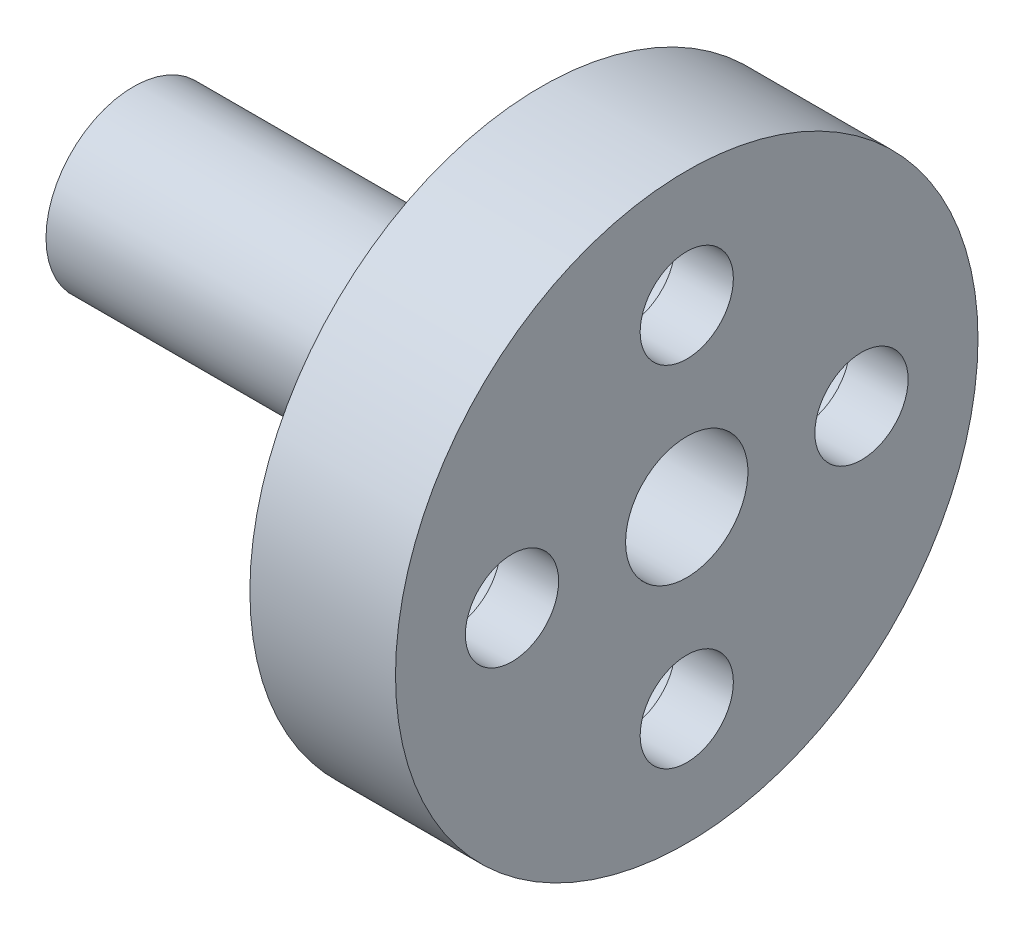
ISO-10303-21;
HEADER;
FILE_DESCRIPTION(('STEP AP214'),'2;1');
FILE_NAME('part.step','',(''),(''),'','','');
FILE_SCHEMA(('AUTOMOTIVE_DESIGN { 1 0 10303 214 1 1 1 1 }'));
ENDSEC;
DATA;
#1=APPLICATION_CONTEXT('core data for automotive mechanical design processes');
#2=APPLICATION_PROTOCOL_DEFINITION('international standard','automotive_design',2000,#1);
#3=PRODUCT_CONTEXT('',#1,'mechanical');
#4=PRODUCT('Part','Part','',(#3));
#5=PRODUCT_RELATED_PRODUCT_CATEGORY('part','',(#4));
#6=PRODUCT_DEFINITION_FORMATION('','',#4);
#7=PRODUCT_DEFINITION_CONTEXT('part definition',#1,'design');
#8=PRODUCT_DEFINITION('design','',#6,#7);
#9=PRODUCT_DEFINITION_SHAPE('','',#8);
#10=(LENGTH_UNIT() NAMED_UNIT(*) SI_UNIT(.MILLI.,.METRE.));
#11=(NAMED_UNIT(*) PLANE_ANGLE_UNIT() SI_UNIT($,.RADIAN.));
#12=(NAMED_UNIT(*) SI_UNIT($,.STERADIAN.) SOLID_ANGLE_UNIT());
#13=UNCERTAINTY_MEASURE_WITH_UNIT(LENGTH_MEASURE(1.E-05),#10,'distance_accuracy_value','');
#14=(GEOMETRIC_REPRESENTATION_CONTEXT(3) GLOBAL_UNCERTAINTY_ASSIGNED_CONTEXT((#13)) GLOBAL_UNIT_ASSIGNED_CONTEXT((#10,
#11,#12)) REPRESENTATION_CONTEXT('',''));
#15=CARTESIAN_POINT('',(0.,0.,0.));
#16=DIRECTION('',(0.,0.,1.));
#17=DIRECTION('',(1.,0.,0.));
#18=AXIS2_PLACEMENT_3D('',#15,#16,#17);
#19=CARTESIAN_POINT('',(-10.,0.,0.));
#20=DIRECTION('',(-1.,0.,0.));
#21=DIRECTION('',(0.,0.,1.));
#22=AXIS2_PLACEMENT_3D('',#19,#20,#21);
#23=CYLINDRICAL_SURFACE('',#22,2.1);
#24=CARTESIAN_POINT('',(0.,0.,0.));
#25=DIRECTION('',(-1.,0.,0.));
#26=DIRECTION('',(0.,0.,1.));
#27=AXIS2_PLACEMENT_3D('',#24,#25,#26);
#28=CIRCLE('',#27,2.1);
#29=CARTESIAN_POINT('',(0.,0.,2.1));
#30=VERTEX_POINT('',#29);
#31=EDGE_CURVE('E10',#30,#30,#28,.T.);
#32=ORIENTED_EDGE('',*,*,#31,.F.);
#33=EDGE_LOOP('',(#32));
#34=FACE_BOUND('',#33,.T.);
#35=CARTESIAN_POINT('',(-13.,0.,0.));
#36=DIRECTION('',(-1.,0.,0.));
#37=DIRECTION('',(0.,0.,1.));
#38=AXIS2_PLACEMENT_3D('',#35,#36,#37);
#39=CIRCLE('',#38,2.1);
#40=CARTESIAN_POINT('',(-13.,0.,2.1));
#41=VERTEX_POINT('',#40);
#42=EDGE_CURVE('E86',#41,#41,#39,.T.);
#43=ORIENTED_EDGE('',*,*,#42,.T.);
#44=EDGE_LOOP('',(#43));
#45=FACE_BOUND('',#44,.T.);
#46=ADVANCED_FACE('F39',(#34,#45),#23,.F.);
#47=CARTESIAN_POINT('',(0.,2.1,0.));
#48=DIRECTION('',(-1.,0.,0.));
#49=DIRECTION('',(0.,0.,1.));
#50=AXIS2_PLACEMENT_3D('',#47,#48,#49);
#51=PLANE('',#50);
#52=CARTESIAN_POINT('',(0.,0.,6.));
#53=DIRECTION('',(-1.,0.,0.));
#54=DIRECTION('',(0.,0.,1.));
#55=AXIS2_PLACEMENT_3D('',#52,#53,#54);
#56=CIRCLE('',#55,1.6);
#57=CARTESIAN_POINT('',(0.,0.,7.6));
#58=VERTEX_POINT('',#57);
#59=EDGE_CURVE('E83',#58,#58,#56,.T.);
#60=ORIENTED_EDGE('',*,*,#59,.T.);
#61=EDGE_LOOP('',(#60));
#62=FACE_BOUND('',#61,.T.);
#63=CARTESIAN_POINT('',(0.,0.,-6.));
#64=DIRECTION('',(-1.,0.,0.));
#65=DIRECTION('',(0.,0.,1.));
#66=AXIS2_PLACEMENT_3D('',#63,#64,#65);
#67=CIRCLE('',#66,1.6);
#68=CARTESIAN_POINT('',(0.,0.,-4.4));
#69=VERTEX_POINT('',#68);
#70=EDGE_CURVE('E75',#69,#69,#67,.T.);
#71=ORIENTED_EDGE('',*,*,#70,.T.);
#72=EDGE_LOOP('',(#71));
#73=FACE_BOUND('',#72,.T.);
#74=CARTESIAN_POINT('',(0.,6.,0.));
#75=DIRECTION('',(-1.,0.,0.));
#76=DIRECTION('',(0.,0.,1.));
#77=AXIS2_PLACEMENT_3D('',#74,#75,#76);
#78=CIRCLE('',#77,1.6);
#79=CARTESIAN_POINT('',(0.,6.,1.6));
#80=VERTEX_POINT('',#79);
#81=EDGE_CURVE('E70',#80,#80,#78,.T.);
#82=ORIENTED_EDGE('',*,*,#81,.T.);
#83=EDGE_LOOP('',(#82));
#84=FACE_BOUND('',#83,.T.);
#85=CARTESIAN_POINT('',(0.,-6.,0.));
#86=DIRECTION('',(-1.,0.,0.));
#87=DIRECTION('',(0.,0.,1.));
#88=AXIS2_PLACEMENT_3D('',#85,#86,#87);
#89=CIRCLE('',#88,1.6);
#90=CARTESIAN_POINT('',(0.,-6.,1.6));
#91=VERTEX_POINT('',#90);
#92=EDGE_CURVE('E66',#91,#91,#89,.T.);
#93=ORIENTED_EDGE('',*,*,#92,.T.);
#94=EDGE_LOOP('',(#93));
#95=FACE_BOUND('',#94,.T.);
#96=CARTESIAN_POINT('',(0.,0.,0.));
#97=DIRECTION('',(-1.,0.,0.));
#98=DIRECTION('',(0.,0.,1.));
#99=AXIS2_PLACEMENT_3D('',#96,#97,#98);
#100=CIRCLE('',#99,10.);
#101=CARTESIAN_POINT('',(0.,0.,10.));
#102=VERTEX_POINT('',#101);
#103=EDGE_CURVE('E46',#102,#102,#100,.T.);
#104=ORIENTED_EDGE('',*,*,#103,.F.);
#105=EDGE_LOOP('',(#104));
#106=FACE_BOUND('',#105,.T.);
#107=ORIENTED_EDGE('',*,*,#31,.T.);
#108=EDGE_LOOP('',(#107));
#109=FACE_BOUND('',#108,.T.);
#110=ADVANCED_FACE('F102',(#62,#73,#84,#95,#106,#109),#51,.F.);
#111=CARTESIAN_POINT('',(-10.,0.,0.));
#112=DIRECTION('',(-1.,0.,0.));
#113=DIRECTION('',(0.,0.,1.));
#114=AXIS2_PLACEMENT_3D('',#111,#112,#113);
#115=CYLINDRICAL_SURFACE('',#114,10.);
#116=CARTESIAN_POINT('',(-5.,0.,0.));
#117=DIRECTION('',(-1.,0.,0.));
#118=DIRECTION('',(0.,0.,1.));
#119=AXIS2_PLACEMENT_3D('',#116,#117,#118);
#120=CIRCLE('',#119,10.);
#121=CARTESIAN_POINT('',(-5.,0.,10.));
#122=VERTEX_POINT('',#121);
#123=EDGE_CURVE('E51',#122,#122,#120,.T.);
#124=ORIENTED_EDGE('',*,*,#123,.F.);
#125=EDGE_LOOP('',(#124));
#126=FACE_BOUND('',#125,.T.);
#127=ORIENTED_EDGE('',*,*,#103,.T.);
#128=EDGE_LOOP('',(#127));
#129=FACE_BOUND('',#128,.T.);
#130=ADVANCED_FACE('F99',(#126,#129),#115,.T.);
#131=CARTESIAN_POINT('',(-5.,10.,0.));
#132=DIRECTION('',(1.,0.,0.));
#133=DIRECTION('',(0.,0.,-1.));
#134=AXIS2_PLACEMENT_3D('',#131,#132,#133);
#135=PLANE('',#134);
#136=CARTESIAN_POINT('',(-5.,0.,6.));
#137=DIRECTION('',(1.,0.,0.));
#138=DIRECTION('',(0.,0.,-1.));
#139=AXIS2_PLACEMENT_3D('',#136,#137,#138);
#140=CIRCLE('',#139,2.85);
#141=CARTESIAN_POINT('',(-5.,0.,3.15));
#142=VERTEX_POINT('',#141);
#143=EDGE_CURVE('E182',#142,#142,#140,.T.);
#144=ORIENTED_EDGE('',*,*,#143,.T.);
#145=EDGE_LOOP('',(#144));
#146=FACE_BOUND('',#145,.T.);
#147=CARTESIAN_POINT('',(-5.,0.,-6.));
#148=DIRECTION('',(1.,0.,0.));
#149=DIRECTION('',(0.,0.,-1.));
#150=AXIS2_PLACEMENT_3D('',#147,#148,#149);
#151=CIRCLE('',#150,2.85);
#152=CARTESIAN_POINT('',(-5.,0.,-8.85));
#153=VERTEX_POINT('',#152);
#154=EDGE_CURVE('E185',#153,#153,#151,.T.);
#155=ORIENTED_EDGE('',*,*,#154,.T.);
#156=EDGE_LOOP('',(#155));
#157=FACE_BOUND('',#156,.T.);
#158=CARTESIAN_POINT('',(-5.,6.,0.));
#159=DIRECTION('',(1.,0.,0.));
#160=DIRECTION('',(0.,0.,-1.));
#161=AXIS2_PLACEMENT_3D('',#158,#159,#160);
#162=CIRCLE('',#161,2.85);
#163=CARTESIAN_POINT('',(-5.,6.,-2.85));
#164=VERTEX_POINT('',#163);
#165=EDGE_CURVE('E193',#164,#164,#162,.T.);
#166=ORIENTED_EDGE('',*,*,#165,.T.);
#167=EDGE_LOOP('',(#166));
#168=FACE_BOUND('',#167,.T.);
#169=CARTESIAN_POINT('',(-5.,-6.,0.));
#170=DIRECTION('',(1.,0.,0.));
#171=DIRECTION('',(0.,0.,-1.));
#172=AXIS2_PLACEMENT_3D('',#169,#170,#171);
#173=CIRCLE('',#172,2.85);
#174=CARTESIAN_POINT('',(-5.,-6.,-2.85));
#175=VERTEX_POINT('',#174);
#176=EDGE_CURVE('E198',#175,#175,#173,.T.);
#177=ORIENTED_EDGE('',*,*,#176,.T.);
#178=EDGE_LOOP('',(#177));
#179=FACE_BOUND('',#178,.T.);
#180=CARTESIAN_POINT('',(-5.,0.,0.));
#181=DIRECTION('',(-1.,0.,0.));
#182=DIRECTION('',(0.,0.,1.));
#183=AXIS2_PLACEMENT_3D('',#180,#181,#182);
#184=CIRCLE('',#183,3.);
#185=CARTESIAN_POINT('',(-5.,0.,3.));
#186=VERTEX_POINT('',#185);
#187=EDGE_CURVE('E92',#186,#186,#184,.T.);
#188=ORIENTED_EDGE('',*,*,#187,.F.);
#189=EDGE_LOOP('',(#188));
#190=FACE_BOUND('',#189,.T.);
#191=ORIENTED_EDGE('',*,*,#123,.T.);
#192=EDGE_LOOP('',(#191));
#193=FACE_BOUND('',#192,.T.);
#194=ADVANCED_FACE('F97',(#146,#157,#168,#179,#190,#193),#135,.F.);
#195=CARTESIAN_POINT('',(-10.,0.,0.));
#196=DIRECTION('',(-1.,0.,0.));
#197=DIRECTION('',(0.,0.,1.));
#198=AXIS2_PLACEMENT_3D('',#195,#196,#197);
#199=CYLINDRICAL_SURFACE('',#198,3.);
#200=CARTESIAN_POINT('',(-19.,0.,0.));
#201=DIRECTION('',(-1.,0.,0.));
#202=DIRECTION('',(0.,0.,1.));
#203=AXIS2_PLACEMENT_3D('',#200,#201,#202);
#204=CIRCLE('',#203,3.);
#205=CARTESIAN_POINT('',(-19.,0.,3.));
#206=VERTEX_POINT('',#205);
#207=EDGE_CURVE('E89',#206,#206,#204,.T.);
#208=ORIENTED_EDGE('',*,*,#207,.F.);
#209=EDGE_LOOP('',(#208));
#210=FACE_BOUND('',#209,.T.);
#211=ORIENTED_EDGE('',*,*,#187,.T.);
#212=EDGE_LOOP('',(#211));
#213=FACE_BOUND('',#212,.T.);
#214=ADVANCED_FACE('F117',(#210,#213),#199,.T.);
#215=CARTESIAN_POINT('',(-19.,3.,0.));
#216=DIRECTION('',(1.,0.,0.));
#217=DIRECTION('',(0.,0.,-1.));
#218=AXIS2_PLACEMENT_3D('',#215,#216,#217);
#219=PLANE('',#218);
#220=ORIENTED_EDGE('',*,*,#207,.T.);
#221=EDGE_LOOP('',(#220));
#222=FACE_BOUND('',#221,.T.);
#223=ADVANCED_FACE('F121',(#222),#219,.F.);
#224=CARTESIAN_POINT('',(-13.,0.,0.));
#225=DIRECTION('',(-1.,0.,0.));
#226=DIRECTION('',(0.,0.,1.));
#227=AXIS2_PLACEMENT_3D('',#224,#225,#226);
#228=PLANE('',#227);
#229=ORIENTED_EDGE('',*,*,#42,.F.);
#230=EDGE_LOOP('',(#229));
#231=FACE_BOUND('',#230,.T.);
#232=ADVANCED_FACE('F125',(#231),#228,.F.);
#233=CARTESIAN_POINT('',(-19.,-6.,0.));
#234=DIRECTION('',(1.,0.,0.));
#235=DIRECTION('',(0.,0.,-1.));
#236=AXIS2_PLACEMENT_3D('',#233,#234,#235);
#237=CYLINDRICAL_SURFACE('',#236,1.6);
#238=CARTESIAN_POINT('',(-2.,-6.,0.));
#239=DIRECTION('',(1.,0.,0.));
#240=DIRECTION('',(0.,0.,-1.));
#241=AXIS2_PLACEMENT_3D('',#238,#239,#240);
#242=CIRCLE('',#241,1.6);
#243=CARTESIAN_POINT('',(-2.,-6.,-1.6));
#244=VERTEX_POINT('',#243);
#245=EDGE_CURVE('E42',#244,#244,#242,.F.);
#246=ORIENTED_EDGE('',*,*,#245,.T.);
#247=EDGE_LOOP('',(#246));
#248=FACE_BOUND('',#247,.T.);
#249=ORIENTED_EDGE('',*,*,#92,.F.);
#250=EDGE_LOOP('',(#249));
#251=FACE_BOUND('',#250,.T.);
#252=ADVANCED_FACE('F128',(#248,#251),#237,.F.);
#253=CARTESIAN_POINT('',(-19.,6.,0.));
#254=DIRECTION('',(1.,0.,0.));
#255=DIRECTION('',(0.,0.,-1.));
#256=AXIS2_PLACEMENT_3D('',#253,#254,#255);
#257=CYLINDRICAL_SURFACE('',#256,1.6);
#258=CARTESIAN_POINT('',(-2.,6.,0.));
#259=DIRECTION('',(1.,0.,0.));
#260=DIRECTION('',(0.,0.,-1.));
#261=AXIS2_PLACEMENT_3D('',#258,#259,#260);
#262=CIRCLE('',#261,1.6);
#263=CARTESIAN_POINT('',(-2.,6.,-1.6));
#264=VERTEX_POINT('',#263);
#265=EDGE_CURVE('E61',#264,#264,#262,.F.);
#266=ORIENTED_EDGE('',*,*,#265,.T.);
#267=EDGE_LOOP('',(#266));
#268=FACE_BOUND('',#267,.T.);
#269=ORIENTED_EDGE('',*,*,#81,.F.);
#270=EDGE_LOOP('',(#269));
#271=FACE_BOUND('',#270,.T.);
#272=ADVANCED_FACE('F132',(#268,#271),#257,.F.);
#273=CARTESIAN_POINT('',(-19.,0.,-6.));
#274=DIRECTION('',(1.,0.,0.));
#275=DIRECTION('',(0.,0.,-1.));
#276=AXIS2_PLACEMENT_3D('',#273,#274,#275);
#277=CYLINDRICAL_SURFACE('',#276,1.6);
#278=CARTESIAN_POINT('',(-2.,0.,-6.));
#279=DIRECTION('',(1.,0.,0.));
#280=DIRECTION('',(0.,0.,-1.));
#281=AXIS2_PLACEMENT_3D('',#278,#279,#280);
#282=CIRCLE('',#281,1.6);
#283=CARTESIAN_POINT('',(-2.,0.,-7.6));
#284=VERTEX_POINT('',#283);
#285=EDGE_CURVE('E58',#284,#284,#282,.F.);
#286=ORIENTED_EDGE('',*,*,#285,.T.);
#287=EDGE_LOOP('',(#286));
#288=FACE_BOUND('',#287,.T.);
#289=ORIENTED_EDGE('',*,*,#70,.F.);
#290=EDGE_LOOP('',(#289));
#291=FACE_BOUND('',#290,.T.);
#292=ADVANCED_FACE('F135',(#288,#291),#277,.F.);
#293=CARTESIAN_POINT('',(-19.,0.,6.));
#294=DIRECTION('',(1.,0.,0.));
#295=DIRECTION('',(0.,0.,-1.));
#296=AXIS2_PLACEMENT_3D('',#293,#294,#295);
#297=CYLINDRICAL_SURFACE('',#296,1.6);
#298=CARTESIAN_POINT('',(-2.,0.,6.));
#299=DIRECTION('',(1.,0.,0.));
#300=DIRECTION('',(0.,0.,-1.));
#301=AXIS2_PLACEMENT_3D('',#298,#299,#300);
#302=CIRCLE('',#301,1.6);
#303=CARTESIAN_POINT('',(-2.,0.,4.4));
#304=VERTEX_POINT('',#303);
#305=EDGE_CURVE('E55',#304,#304,#302,.F.);
#306=ORIENTED_EDGE('',*,*,#305,.T.);
#307=EDGE_LOOP('',(#306));
#308=FACE_BOUND('',#307,.T.);
#309=ORIENTED_EDGE('',*,*,#59,.F.);
#310=EDGE_LOOP('',(#309));
#311=FACE_BOUND('',#310,.T.);
#312=ADVANCED_FACE('F138',(#308,#311),#297,.F.);
#313=CARTESIAN_POINT('',(-2.,0.,6.));
#314=DIRECTION('',(1.,0.,0.));
#315=DIRECTION('',(0.,0.,-1.));
#316=AXIS2_PLACEMENT_3D('',#313,#314,#315);
#317=PLANE('',#316);
#318=CARTESIAN_POINT('',(-2.,0.,6.));
#319=DIRECTION('',(1.,0.,0.));
#320=DIRECTION('',(0.,0.,-1.));
#321=AXIS2_PLACEMENT_3D('',#318,#319,#320);
#322=CIRCLE('',#321,2.85);
#323=CARTESIAN_POINT('',(-2.,0.,3.15));
#324=VERTEX_POINT('',#323);
#325=EDGE_CURVE('E59',#324,#324,#322,.T.);
#326=ORIENTED_EDGE('',*,*,#325,.F.);
#327=EDGE_LOOP('',(#326));
#328=FACE_BOUND('',#327,.T.);
#329=ORIENTED_EDGE('',*,*,#305,.F.);
#330=EDGE_LOOP('',(#329));
#331=FACE_BOUND('',#330,.T.);
#332=ADVANCED_FACE('F142',(#328,#331),#317,.F.);
#333=CARTESIAN_POINT('',(-2.,0.,6.));
#334=DIRECTION('',(-1.,0.,0.));
#335=DIRECTION('',(0.,0.,1.));
#336=AXIS2_PLACEMENT_3D('',#333,#334,#335);
#337=CYLINDRICAL_SURFACE('',#336,2.85);
#338=ORIENTED_EDGE('',*,*,#325,.T.);
#339=EDGE_LOOP('',(#338));
#340=FACE_BOUND('',#339,.T.);
#341=ORIENTED_EDGE('',*,*,#143,.F.);
#342=EDGE_LOOP('',(#341));
#343=FACE_BOUND('',#342,.T.);
#344=ADVANCED_FACE('F164',(#340,#343),#337,.F.);
#345=CARTESIAN_POINT('',(-2.,0.,-6.));
#346=DIRECTION('',(1.,0.,0.));
#347=DIRECTION('',(0.,0.,-1.));
#348=AXIS2_PLACEMENT_3D('',#345,#346,#347);
#349=PLANE('',#348);
#350=CARTESIAN_POINT('',(-2.,0.,-6.));
#351=DIRECTION('',(1.,0.,0.));
#352=DIRECTION('',(0.,0.,-1.));
#353=AXIS2_PLACEMENT_3D('',#350,#351,#352);
#354=CIRCLE('',#353,2.85);
#355=CARTESIAN_POINT('',(-2.,0.,-8.85));
#356=VERTEX_POINT('',#355);
#357=EDGE_CURVE('E190',#356,#356,#354,.T.);
#358=ORIENTED_EDGE('',*,*,#357,.F.);
#359=EDGE_LOOP('',(#358));
#360=FACE_BOUND('',#359,.T.);
#361=ORIENTED_EDGE('',*,*,#285,.F.);
#362=EDGE_LOOP('',(#361));
#363=FACE_BOUND('',#362,.T.);
#364=ADVANCED_FACE('F161',(#360,#363),#349,.F.);
#365=CARTESIAN_POINT('',(-2.,0.,-6.));
#366=DIRECTION('',(-1.,0.,0.));
#367=DIRECTION('',(0.,0.,1.));
#368=AXIS2_PLACEMENT_3D('',#365,#366,#367);
#369=CYLINDRICAL_SURFACE('',#368,2.85);
#370=ORIENTED_EDGE('',*,*,#357,.T.);
#371=EDGE_LOOP('',(#370));
#372=FACE_BOUND('',#371,.T.);
#373=ORIENTED_EDGE('',*,*,#154,.F.);
#374=EDGE_LOOP('',(#373));
#375=FACE_BOUND('',#374,.T.);
#376=ADVANCED_FACE('F156',(#372,#375),#369,.F.);
#377=CARTESIAN_POINT('',(-2.,6.,0.));
#378=DIRECTION('',(1.,0.,0.));
#379=DIRECTION('',(0.,0.,-1.));
#380=AXIS2_PLACEMENT_3D('',#377,#378,#379);
#381=PLANE('',#380);
#382=CARTESIAN_POINT('',(-2.,6.,0.));
#383=DIRECTION('',(1.,0.,0.));
#384=DIRECTION('',(0.,0.,-1.));
#385=AXIS2_PLACEMENT_3D('',#382,#383,#384);
#386=CIRCLE('',#385,2.85);
#387=CARTESIAN_POINT('',(-2.,6.,-2.85));
#388=VERTEX_POINT('',#387);
#389=EDGE_CURVE('E196',#388,#388,#386,.T.);
#390=ORIENTED_EDGE('',*,*,#389,.F.);
#391=EDGE_LOOP('',(#390));
#392=FACE_BOUND('',#391,.T.);
#393=ORIENTED_EDGE('',*,*,#265,.F.);
#394=EDGE_LOOP('',(#393));
#395=FACE_BOUND('',#394,.T.);
#396=ADVANCED_FACE('F153',(#392,#395),#381,.F.);
#397=CARTESIAN_POINT('',(-2.,6.,0.));
#398=DIRECTION('',(-1.,0.,0.));
#399=DIRECTION('',(0.,0.,1.));
#400=AXIS2_PLACEMENT_3D('',#397,#398,#399);
#401=CYLINDRICAL_SURFACE('',#400,2.85);
#402=ORIENTED_EDGE('',*,*,#389,.T.);
#403=EDGE_LOOP('',(#402));
#404=FACE_BOUND('',#403,.T.);
#405=ORIENTED_EDGE('',*,*,#165,.F.);
#406=EDGE_LOOP('',(#405));
#407=FACE_BOUND('',#406,.T.);
#408=ADVANCED_FACE('F148',(#404,#407),#401,.F.);
#409=CARTESIAN_POINT('',(-2.,-6.,0.));
#410=DIRECTION('',(1.,0.,0.));
#411=DIRECTION('',(0.,0.,-1.));
#412=AXIS2_PLACEMENT_3D('',#409,#410,#411);
#413=PLANE('',#412);
#414=CARTESIAN_POINT('',(-2.,-6.,0.));
#415=DIRECTION('',(1.,0.,0.));
#416=DIRECTION('',(0.,0.,-1.));
#417=AXIS2_PLACEMENT_3D('',#414,#415,#416);
#418=CIRCLE('',#417,2.85);
#419=CARTESIAN_POINT('',(-2.,-6.,-2.85));
#420=VERTEX_POINT('',#419);
#421=EDGE_CURVE('E78',#420,#420,#418,.T.);
#422=ORIENTED_EDGE('',*,*,#421,.F.);
#423=EDGE_LOOP('',(#422));
#424=FACE_BOUND('',#423,.T.);
#425=ORIENTED_EDGE('',*,*,#245,.F.);
#426=EDGE_LOOP('',(#425));
#427=FACE_BOUND('',#426,.T.);
#428=ADVANCED_FACE('F144',(#424,#427),#413,.F.);
#429=CARTESIAN_POINT('',(-2.,-6.,0.));
#430=DIRECTION('',(-1.,0.,0.));
#431=DIRECTION('',(0.,0.,1.));
#432=AXIS2_PLACEMENT_3D('',#429,#430,#431);
#433=CYLINDRICAL_SURFACE('',#432,2.85);
#434=ORIENTED_EDGE('',*,*,#421,.T.);
#435=EDGE_LOOP('',(#434));
#436=FACE_BOUND('',#435,.T.);
#437=ORIENTED_EDGE('',*,*,#176,.F.);
#438=EDGE_LOOP('',(#437));
#439=FACE_BOUND('',#438,.T.);
#440=ADVANCED_FACE('F147',(#436,#439),#433,.F.);
#441=CLOSED_SHELL('',(#46,#110,#130,#194,#214,#223,#232,#252,#272,#292,#312,#332,#344,#364,#376,
#396,#408,#428,#440));
#442=MANIFOLD_SOLID_BREP('B2',#441);
#443=ADVANCED_BREP_SHAPE_REPRESENTATION('',(#18,#442),#14);
#444=SHAPE_DEFINITION_REPRESENTATION(#9,#443);
ENDSEC;
END-ISO-10303-21;
